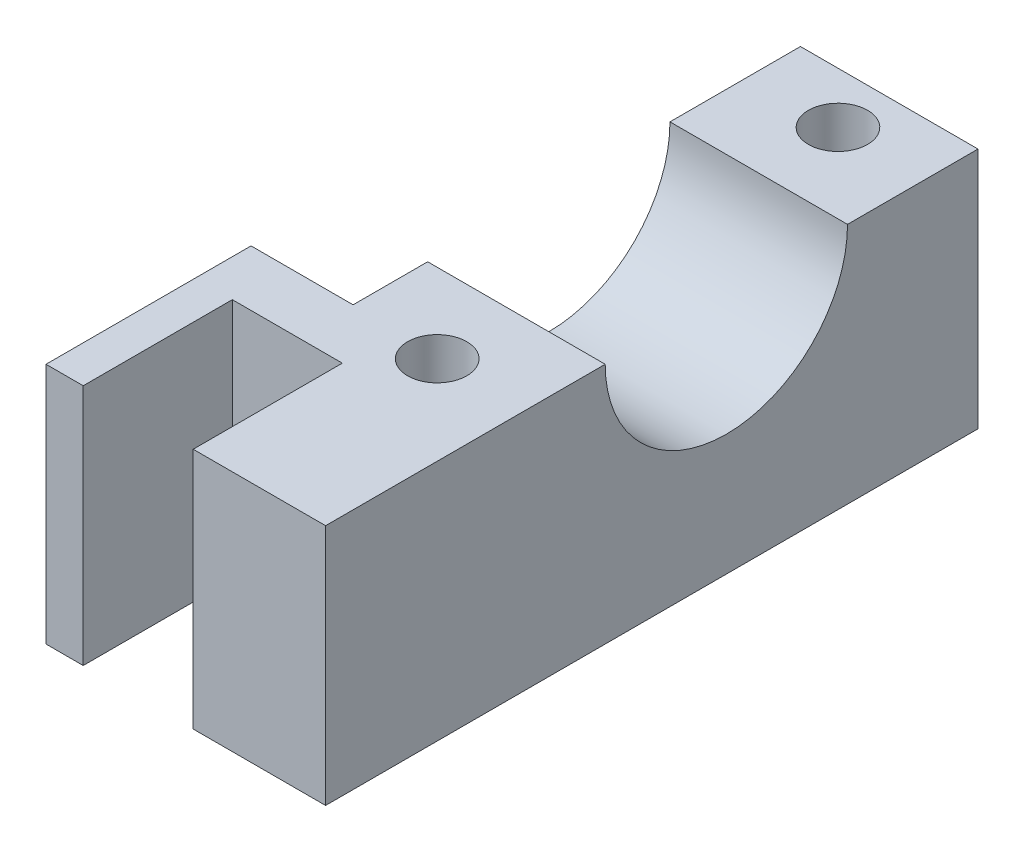
ISO-10303-21;
HEADER;
FILE_DESCRIPTION(('STEP AP214'),'2;1');
FILE_NAME('part.step','',(''),(''),'','','');
FILE_SCHEMA(('AUTOMOTIVE_DESIGN { 1 0 10303 214 1 1 1 1 }'));
ENDSEC;
DATA;
#1=APPLICATION_CONTEXT('core data for automotive mechanical design processes');
#2=APPLICATION_PROTOCOL_DEFINITION('international standard','automotive_design',2000,#1);
#3=PRODUCT_CONTEXT('',#1,'mechanical');
#4=PRODUCT('Part','Part','',(#3));
#5=PRODUCT_RELATED_PRODUCT_CATEGORY('part','',(#4));
#6=PRODUCT_DEFINITION_FORMATION('','',#4);
#7=PRODUCT_DEFINITION_CONTEXT('part definition',#1,'design');
#8=PRODUCT_DEFINITION('design','',#6,#7);
#9=PRODUCT_DEFINITION_SHAPE('','',#8);
#10=(LENGTH_UNIT() NAMED_UNIT(*) SI_UNIT(.MILLI.,.METRE.));
#11=(NAMED_UNIT(*) PLANE_ANGLE_UNIT() SI_UNIT($,.RADIAN.));
#12=(NAMED_UNIT(*) SI_UNIT($,.STERADIAN.) SOLID_ANGLE_UNIT());
#13=UNCERTAINTY_MEASURE_WITH_UNIT(LENGTH_MEASURE(1.E-05),#10,'distance_accuracy_value','');
#14=(GEOMETRIC_REPRESENTATION_CONTEXT(3) GLOBAL_UNCERTAINTY_ASSIGNED_CONTEXT((#13)) GLOBAL_UNIT_ASSIGNED_CONTEXT((#10,
#11,#12)) REPRESENTATION_CONTEXT('',''));
#15=CARTESIAN_POINT('',(0.,0.,0.));
#16=DIRECTION('',(0.,0.,1.));
#17=DIRECTION('',(1.,0.,0.));
#18=AXIS2_PLACEMENT_3D('',#15,#16,#17);
#19=CARTESIAN_POINT('',(15.,0.,13.5));
#20=DIRECTION('',(0.,0.,-1.));
#21=DIRECTION('',(0.,1.,0.));
#22=AXIS2_PLACEMENT_3D('',#19,#20,#21);
#23=PLANE('',#22);
#24=DIRECTION('',(0.,-1.,0.));
#25=VECTOR('',#24,1.);
#26=CARTESIAN_POINT('',(7.89684816109172,-13.,13.5));
#27=LINE('',#26,#25);
#28=CARTESIAN_POINT('',(7.89684816109172,0.,13.5));
#29=VERTEX_POINT('',#28);
#30=CARTESIAN_POINT('',(7.89684816109172,-13.,13.5));
#31=VERTEX_POINT('',#30);
#32=EDGE_CURVE('E151',#29,#31,#27,.T.);
#33=ORIENTED_EDGE('',*,*,#32,.F.);
#34=DIRECTION('',(-1.,0.,0.));
#35=VECTOR('',#34,1.);
#36=CARTESIAN_POINT('',(15.,0.,13.5));
#37=LINE('',#36,#35);
#38=CARTESIAN_POINT('',(1.99684816109172,0.,13.5));
#39=VERTEX_POINT('',#38);
#40=EDGE_CURVE('E209',#29,#39,#37,.T.);
#41=ORIENTED_EDGE('',*,*,#40,.T.);
#42=DIRECTION('',(0.,1.,0.));
#43=VECTOR('',#42,1.);
#44=CARTESIAN_POINT('',(1.99684816109172,-13.,13.5));
#45=LINE('',#44,#43);
#46=CARTESIAN_POINT('',(1.99684816109172,-13.,13.5));
#47=VERTEX_POINT('',#46);
#48=EDGE_CURVE('E167',#47,#39,#45,.T.);
#49=ORIENTED_EDGE('',*,*,#48,.F.);
#50=DIRECTION('',(-1.,0.,0.));
#51=VECTOR('',#50,1.);
#52=CARTESIAN_POINT('',(15.,-13.,13.5));
#53=LINE('',#52,#51);
#54=EDGE_CURVE('E11',#31,#47,#53,.T.);
#55=ORIENTED_EDGE('',*,*,#54,.F.);
#56=EDGE_LOOP('',(#33,#41,#49,#55));
#57=FACE_BOUND('',#56,.T.);
#58=ADVANCED_FACE('F33',(#57),#23,.F.);
#59=CARTESIAN_POINT('',(15.,-13.,13.5));
#60=DIRECTION('',(0.,1.,0.));
#61=DIRECTION('',(0.,0.,1.));
#62=AXIS2_PLACEMENT_3D('',#59,#60,#61);
#63=PLANE('',#62);
#64=CARTESIAN_POINT('',(10.2375,-13.,10.75));
#65=DIRECTION('',(0.,-1.,0.));
#66=DIRECTION('',(0.,0.,-1.));
#67=AXIS2_PLACEMENT_3D('',#64,#65,#66);
#68=CIRCLE('',#67,1.5875);
#69=CARTESIAN_POINT('',(10.2375,-13.,9.1625));
#70=VERTEX_POINT('',#69);
#71=EDGE_CURVE('E186',#70,#70,#68,.T.);
#72=ORIENTED_EDGE('',*,*,#71,.F.);
#73=EDGE_LOOP('',(#72));
#74=FACE_BOUND('',#73,.T.);
#75=CARTESIAN_POINT('',(10.2375,-13.,-10.75));
#76=DIRECTION('',(0.,-1.,0.));
#77=DIRECTION('',(0.,0.,-1.));
#78=AXIS2_PLACEMENT_3D('',#75,#76,#77);
#79=CIRCLE('',#78,1.5875);
#80=CARTESIAN_POINT('',(10.2375,-13.,-12.3375));
#81=VERTEX_POINT('',#80);
#82=EDGE_CURVE('E190',#81,#81,#79,.T.);
#83=ORIENTED_EDGE('',*,*,#82,.F.);
#84=EDGE_LOOP('',(#83));
#85=FACE_BOUND('',#84,.T.);
#86=DIRECTION('',(1.,0.,0.));
#87=VECTOR('',#86,1.);
#88=CARTESIAN_POINT('',(0.,-13.,10.5));
#89=LINE('',#88,#87);
#90=CARTESIAN_POINT('',(0.,-13.,10.5));
#91=VERTEX_POINT('',#90);
#92=CARTESIAN_POINT('',(5.475,-13.,10.5));
#93=VERTEX_POINT('',#92);
#94=EDGE_CURVE('E47',#91,#93,#89,.T.);
#95=ORIENTED_EDGE('',*,*,#94,.T.);
#96=DIRECTION('',(0.,0.,-1.));
#97=VECTOR('',#96,1.);
#98=CARTESIAN_POINT('',(5.475,-13.,-13.5));
#99=LINE('',#98,#97);
#100=CARTESIAN_POINT('',(5.475,-13.,-13.5));
#101=VERTEX_POINT('',#100);
#102=EDGE_CURVE('E130',#93,#101,#99,.T.);
#103=ORIENTED_EDGE('',*,*,#102,.T.);
#104=DIRECTION('',(-1.,0.,0.));
#105=VECTOR('',#104,1.);
#106=CARTESIAN_POINT('',(15.,-13.,-13.5));
#107=LINE('',#106,#105);
#108=CARTESIAN_POINT('',(15.,-13.,-13.5));
#109=VERTEX_POINT('',#108);
#110=EDGE_CURVE('E40',#109,#101,#107,.T.);
#111=ORIENTED_EDGE('',*,*,#110,.F.);
#112=DIRECTION('',(0.,0.,-1.));
#113=VECTOR('',#112,1.);
#114=CARTESIAN_POINT('',(15.,-13.,13.5));
#115=LINE('',#114,#113);
#116=CARTESIAN_POINT('',(15.,-13.,21.5));
#117=VERTEX_POINT('',#116);
#118=EDGE_CURVE('E198',#117,#109,#115,.T.);
#119=ORIENTED_EDGE('',*,*,#118,.F.);
#120=DIRECTION('',(1.,0.,0.));
#121=VECTOR('',#120,1.);
#122=CARTESIAN_POINT('',(7.89684816109172,-13.,21.5));
#123=LINE('',#122,#121);
#124=CARTESIAN_POINT('',(7.89684816109172,-13.,21.5));
#125=VERTEX_POINT('',#124);
#126=EDGE_CURVE('E152',#125,#117,#123,.T.);
#127=ORIENTED_EDGE('',*,*,#126,.F.);
#128=DIRECTION('',(0.,0.,-1.));
#129=VECTOR('',#128,1.);
#130=CARTESIAN_POINT('',(7.89684816109172,-13.,21.5));
#131=LINE('',#130,#129);
#132=EDGE_CURVE('E162',#125,#31,#131,.T.);
#133=ORIENTED_EDGE('',*,*,#132,.T.);
#134=ORIENTED_EDGE('',*,*,#54,.T.);
#135=DIRECTION('',(0.,0.,-1.));
#136=VECTOR('',#135,1.);
#137=CARTESIAN_POINT('',(1.99684816109172,-13.,21.5));
#138=LINE('',#137,#136);
#139=CARTESIAN_POINT('',(1.99684816109172,-13.,21.5));
#140=VERTEX_POINT('',#139);
#141=EDGE_CURVE('E183',#140,#47,#138,.T.);
#142=ORIENTED_EDGE('',*,*,#141,.F.);
#143=DIRECTION('',(1.,0.,0.));
#144=VECTOR('',#143,1.);
#145=CARTESIAN_POINT('',(0.,-13.,21.5));
#146=LINE('',#145,#144);
#147=CARTESIAN_POINT('',(0.,-13.,21.5));
#148=VERTEX_POINT('',#147);
#149=EDGE_CURVE('E171',#148,#140,#146,.T.);
#150=ORIENTED_EDGE('',*,*,#149,.F.);
#151=DIRECTION('',(0.,0.,-1.));
#152=VECTOR('',#151,1.);
#153=CARTESIAN_POINT('',(0.,-13.,13.5));
#154=LINE('',#153,#152);
#155=EDGE_CURVE('E139',#148,#91,#154,.T.);
#156=ORIENTED_EDGE('',*,*,#155,.T.);
#157=EDGE_LOOP('',(#95,#103,#111,#119,#127,#133,#134,#142,#150,#156));
#158=FACE_BOUND('',#157,.T.);
#159=ADVANCED_FACE('F137',(#74,#85,#158),#63,.F.);
#160=CARTESIAN_POINT('',(15.,0.,-13.5));
#161=DIRECTION('',(0.,0.,1.));
#162=DIRECTION('',(0.,-1.,0.));
#163=AXIS2_PLACEMENT_3D('',#160,#161,#162);
#164=PLANE('',#163);
#165=ORIENTED_EDGE('',*,*,#110,.T.);
#166=DIRECTION('',(0.,1.,0.));
#167=VECTOR('',#166,1.);
#168=CARTESIAN_POINT('',(5.475,-13.,-13.5));
#169=LINE('',#168,#167);
#170=CARTESIAN_POINT('',(5.475,0.,-13.5));
#171=VERTEX_POINT('',#170);
#172=EDGE_CURVE('E126',#101,#171,#169,.T.);
#173=ORIENTED_EDGE('',*,*,#172,.T.);
#174=DIRECTION('',(-1.,0.,0.));
#175=VECTOR('',#174,1.);
#176=CARTESIAN_POINT('',(15.,0.,-13.5));
#177=LINE('',#176,#175);
#178=CARTESIAN_POINT('',(15.,0.,-13.5));
#179=VERTEX_POINT('',#178);
#180=EDGE_CURVE('E219',#179,#171,#177,.T.);
#181=ORIENTED_EDGE('',*,*,#180,.F.);
#182=DIRECTION('',(0.,1.,0.));
#183=VECTOR('',#182,1.);
#184=CARTESIAN_POINT('',(15.,0.,-13.5));
#185=LINE('',#184,#183);
#186=EDGE_CURVE('E200',#109,#179,#185,.T.);
#187=ORIENTED_EDGE('',*,*,#186,.F.);
#188=EDGE_LOOP('',(#165,#173,#181,#187));
#189=FACE_BOUND('',#188,.T.);
#190=ADVANCED_FACE('F223',(#189),#164,.F.);
#191=CARTESIAN_POINT('',(15.,0.,-6.5));
#192=DIRECTION('',(0.,-1.,0.));
#193=DIRECTION('',(0.,0.,-1.));
#194=AXIS2_PLACEMENT_3D('',#191,#192,#193);
#195=PLANE('',#194);
#196=CARTESIAN_POINT('',(10.2375,0.,-10.75));
#197=DIRECTION('',(0.,-1.,0.));
#198=DIRECTION('',(0.,0.,-1.));
#199=AXIS2_PLACEMENT_3D('',#196,#197,#198);
#200=CIRCLE('',#199,1.5875);
#201=CARTESIAN_POINT('',(10.2375,0.,-12.3375));
#202=VERTEX_POINT('',#201);
#203=EDGE_CURVE('E193',#202,#202,#200,.T.);
#204=ORIENTED_EDGE('',*,*,#203,.T.);
#205=EDGE_LOOP('',(#204));
#206=FACE_BOUND('',#205,.T.);
#207=ORIENTED_EDGE('',*,*,#180,.T.);
#208=DIRECTION('',(0.,0.,-1.));
#209=VECTOR('',#208,1.);
#210=CARTESIAN_POINT('',(5.475,0.,-13.5));
#211=LINE('',#210,#209);
#212=CARTESIAN_POINT('',(5.475,0.,-6.5));
#213=VERTEX_POINT('',#212);
#214=EDGE_CURVE('E142',#213,#171,#211,.T.);
#215=ORIENTED_EDGE('',*,*,#214,.F.);
#216=DIRECTION('',(-1.,0.,0.));
#217=VECTOR('',#216,1.);
#218=CARTESIAN_POINT('',(15.,0.,-6.5));
#219=LINE('',#218,#217);
#220=CARTESIAN_POINT('',(15.,0.,-6.5));
#221=VERTEX_POINT('',#220);
#222=EDGE_CURVE('E216',#221,#213,#219,.T.);
#223=ORIENTED_EDGE('',*,*,#222,.F.);
#224=DIRECTION('',(0.,0.,1.));
#225=VECTOR('',#224,1.);
#226=CARTESIAN_POINT('',(15.,0.,-6.5));
#227=LINE('',#226,#225);
#228=EDGE_CURVE('E203',#179,#221,#227,.T.);
#229=ORIENTED_EDGE('',*,*,#228,.F.);
#230=EDGE_LOOP('',(#207,#215,#223,#229));
#231=FACE_BOUND('',#230,.T.);
#232=ADVANCED_FACE('F262',(#206,#231),#195,.F.);
#233=CARTESIAN_POINT('',(15.,0.,0.));
#234=DIRECTION('',(-1.,0.,0.));
#235=DIRECTION('',(0.,0.,1.));
#236=AXIS2_PLACEMENT_3D('',#233,#234,#235);
#237=CYLINDRICAL_SURFACE('',#236,6.5);
#238=ORIENTED_EDGE('',*,*,#222,.T.);
#239=CARTESIAN_POINT('',(5.475,0.,0.));
#240=DIRECTION('',(1.,0.,0.));
#241=DIRECTION('',(0.,0.,-1.));
#242=AXIS2_PLACEMENT_3D('',#239,#240,#241);
#243=CIRCLE('',#242,6.5);
#244=CARTESIAN_POINT('',(5.475,0.,6.5));
#245=VERTEX_POINT('',#244);
#246=EDGE_CURVE('E146',#213,#245,#243,.F.);
#247=ORIENTED_EDGE('',*,*,#246,.T.);
#248=DIRECTION('',(-1.,0.,0.));
#249=VECTOR('',#248,1.);
#250=CARTESIAN_POINT('',(15.,0.,6.5));
#251=LINE('',#250,#249);
#252=CARTESIAN_POINT('',(15.,0.,6.5));
#253=VERTEX_POINT('',#252);
#254=EDGE_CURVE('E213',#253,#245,#251,.T.);
#255=ORIENTED_EDGE('',*,*,#254,.F.);
#256=CARTESIAN_POINT('',(15.,0.,0.));
#257=DIRECTION('',(-1.,0.,0.));
#258=DIRECTION('',(0.,0.,-1.));
#259=AXIS2_PLACEMENT_3D('',#256,#257,#258);
#260=CIRCLE('',#259,6.5);
#261=EDGE_CURVE('E205',#221,#253,#260,.T.);
#262=ORIENTED_EDGE('',*,*,#261,.F.);
#263=EDGE_LOOP('',(#238,#247,#255,#262));
#264=FACE_BOUND('',#263,.T.);
#265=ADVANCED_FACE('F257',(#264),#237,.F.);
#266=CARTESIAN_POINT('',(15.,0.,13.5));
#267=DIRECTION('',(0.,-1.,0.));
#268=DIRECTION('',(0.,0.,-1.));
#269=AXIS2_PLACEMENT_3D('',#266,#267,#268);
#270=PLANE('',#269);
#271=CARTESIAN_POINT('',(10.2375,0.,10.75));
#272=DIRECTION('',(0.,-1.,0.));
#273=DIRECTION('',(0.,0.,-1.));
#274=AXIS2_PLACEMENT_3D('',#271,#272,#273);
#275=CIRCLE('',#274,1.5875);
#276=CARTESIAN_POINT('',(10.2375,0.,9.1625));
#277=VERTEX_POINT('',#276);
#278=EDGE_CURVE('E187',#277,#277,#275,.T.);
#279=ORIENTED_EDGE('',*,*,#278,.T.);
#280=EDGE_LOOP('',(#279));
#281=FACE_BOUND('',#280,.T.);
#282=ORIENTED_EDGE('',*,*,#254,.T.);
#283=CARTESIAN_POINT('',(5.475,0.,10.5));
#284=VERTEX_POINT('',#283);
#285=EDGE_CURVE('E140',#284,#245,#211,.T.);
#286=ORIENTED_EDGE('',*,*,#285,.F.);
#287=DIRECTION('',(1.,0.,0.));
#288=VECTOR('',#287,1.);
#289=CARTESIAN_POINT('',(0.,0.,10.5));
#290=LINE('',#289,#288);
#291=CARTESIAN_POINT('',(0.,0.,10.5));
#292=VERTEX_POINT('',#291);
#293=EDGE_CURVE('E123',#292,#284,#290,.T.);
#294=ORIENTED_EDGE('',*,*,#293,.F.);
#295=DIRECTION('',(0.,0.,1.));
#296=VECTOR('',#295,1.);
#297=CARTESIAN_POINT('',(0.,0.,13.5));
#298=LINE('',#297,#296);
#299=CARTESIAN_POINT('',(0.,0.,21.5));
#300=VERTEX_POINT('',#299);
#301=EDGE_CURVE('E201',#292,#300,#298,.T.);
#302=ORIENTED_EDGE('',*,*,#301,.T.);
#303=DIRECTION('',(-1.,0.,0.));
#304=VECTOR('',#303,1.);
#305=CARTESIAN_POINT('',(0.,0.,21.5));
#306=LINE('',#305,#304);
#307=CARTESIAN_POINT('',(1.99684816109172,0.,21.5));
#308=VERTEX_POINT('',#307);
#309=EDGE_CURVE('E175',#308,#300,#306,.T.);
#310=ORIENTED_EDGE('',*,*,#309,.F.);
#311=DIRECTION('',(0.,0.,-1.));
#312=VECTOR('',#311,1.);
#313=CARTESIAN_POINT('',(1.99684816109172,0.,21.5));
#314=LINE('',#313,#312);
#315=EDGE_CURVE('E178',#308,#39,#314,.T.);
#316=ORIENTED_EDGE('',*,*,#315,.T.);
#317=ORIENTED_EDGE('',*,*,#40,.F.);
#318=DIRECTION('',(0.,0.,-1.));
#319=VECTOR('',#318,1.);
#320=CARTESIAN_POINT('',(7.89684816109172,0.,21.5));
#321=LINE('',#320,#319);
#322=CARTESIAN_POINT('',(7.89684816109172,0.,21.5));
#323=VERTEX_POINT('',#322);
#324=EDGE_CURVE('E165',#323,#29,#321,.T.);
#325=ORIENTED_EDGE('',*,*,#324,.F.);
#326=DIRECTION('',(-1.,0.,0.));
#327=VECTOR('',#326,1.);
#328=CARTESIAN_POINT('',(7.89684816109172,0.,21.5));
#329=LINE('',#328,#327);
#330=CARTESIAN_POINT('',(15.,0.,21.5));
#331=VERTEX_POINT('',#330);
#332=EDGE_CURVE('E158',#331,#323,#329,.T.);
#333=ORIENTED_EDGE('',*,*,#332,.F.);
#334=DIRECTION('',(0.,0.,1.));
#335=VECTOR('',#334,1.);
#336=CARTESIAN_POINT('',(15.,0.,13.5));
#337=LINE('',#336,#335);
#338=EDGE_CURVE('E207',#253,#331,#337,.T.);
#339=ORIENTED_EDGE('',*,*,#338,.F.);
#340=EDGE_LOOP('',(#282,#286,#294,#302,#310,#316,#317,#325,#333,#339));
#341=FACE_BOUND('',#340,.T.);
#342=ADVANCED_FACE('F253',(#281,#341),#270,.F.);
#343=CARTESIAN_POINT('',(15.,0.,0.));
#344=DIRECTION('',(1.,0.,0.));
#345=DIRECTION('',(0.,0.,-1.));
#346=AXIS2_PLACEMENT_3D('',#343,#344,#345);
#347=PLANE('',#346);
#348=ORIENTED_EDGE('',*,*,#338,.T.);
#349=DIRECTION('',(0.,1.,0.));
#350=VECTOR('',#349,1.);
#351=CARTESIAN_POINT('',(15.,0.,21.5));
#352=LINE('',#351,#350);
#353=EDGE_CURVE('E155',#117,#331,#352,.T.);
#354=ORIENTED_EDGE('',*,*,#353,.F.);
#355=ORIENTED_EDGE('',*,*,#118,.T.);
#356=ORIENTED_EDGE('',*,*,#186,.T.);
#357=ORIENTED_EDGE('',*,*,#228,.T.);
#358=ORIENTED_EDGE('',*,*,#261,.T.);
#359=EDGE_LOOP('',(#348,#354,#355,#356,#357,#358));
#360=FACE_BOUND('',#359,.T.);
#361=ADVANCED_FACE('F228',(#360),#347,.T.);
#362=CARTESIAN_POINT('',(0.,0.,0.));
#363=DIRECTION('',(1.,0.,0.));
#364=DIRECTION('',(0.,0.,-1.));
#365=AXIS2_PLACEMENT_3D('',#362,#363,#364);
#366=PLANE('',#365);
#367=ORIENTED_EDGE('',*,*,#301,.F.);
#368=DIRECTION('',(0.,1.,0.));
#369=VECTOR('',#368,1.);
#370=CARTESIAN_POINT('',(0.,-13.,10.5));
#371=LINE('',#370,#369);
#372=EDGE_CURVE('E127',#91,#292,#371,.T.);
#373=ORIENTED_EDGE('',*,*,#372,.F.);
#374=ORIENTED_EDGE('',*,*,#155,.F.);
#375=DIRECTION('',(0.,-1.,0.));
#376=VECTOR('',#375,1.);
#377=CARTESIAN_POINT('',(0.,0.,21.5));
#378=LINE('',#377,#376);
#379=EDGE_CURVE('E168',#300,#148,#378,.T.);
#380=ORIENTED_EDGE('',*,*,#379,.F.);
#381=EDGE_LOOP('',(#367,#373,#374,#380));
#382=FACE_BOUND('',#381,.T.);
#383=ADVANCED_FACE('F251',(#382),#366,.F.);
#384=CARTESIAN_POINT('',(10.2375,0.,-10.75));
#385=DIRECTION('',(0.,-1.,0.));
#386=DIRECTION('',(0.,0.,-1.));
#387=AXIS2_PLACEMENT_3D('',#384,#385,#386);
#388=CYLINDRICAL_SURFACE('',#387,1.5875);
#389=CARTESIAN_POINT('',(10.2375,0.,-12.3375));
#390=CARTESIAN_POINT('',(10.2375,-0.135416666666667,-12.3375));
#391=CARTESIAN_POINT('',(10.2375,-0.270833333333333,-12.3375));
#392=CARTESIAN_POINT('',(10.2375,-0.541666666666667,-12.3375));
#393=CARTESIAN_POINT('',(10.2375,-0.677083333333333,-12.3375));
#394=CARTESIAN_POINT('',(10.2375,-0.947916666666667,-12.3375));
#395=CARTESIAN_POINT('',(10.2375,-1.08333333333333,-12.3375));
#396=CARTESIAN_POINT('',(10.2375,-1.35416666666667,-12.3375));
#397=CARTESIAN_POINT('',(10.2375,-1.48958333333333,-12.3375));
#398=CARTESIAN_POINT('',(10.2375,-1.76041666666667,-12.3375));
#399=CARTESIAN_POINT('',(10.2375,-1.89583333333333,-12.3375));
#400=CARTESIAN_POINT('',(10.2375,-2.16666666666667,-12.3375));
#401=CARTESIAN_POINT('',(10.2375,-2.30208333333333,-12.3375));
#402=CARTESIAN_POINT('',(10.2375,-2.57291666666667,-12.3375));
#403=CARTESIAN_POINT('',(10.2375,-2.70833333333333,-12.3375));
#404=CARTESIAN_POINT('',(10.2375,-2.97916666666667,-12.3375));
#405=CARTESIAN_POINT('',(10.2375,-3.11458333333333,-12.3375));
#406=CARTESIAN_POINT('',(10.2375,-3.38541666666667,-12.3375));
#407=CARTESIAN_POINT('',(10.2375,-3.52083333333333,-12.3375));
#408=CARTESIAN_POINT('',(10.2375,-3.79166666666667,-12.3375));
#409=CARTESIAN_POINT('',(10.2375,-3.92708333333333,-12.3375));
#410=CARTESIAN_POINT('',(10.2375,-4.19791666666667,-12.3375));
#411=CARTESIAN_POINT('',(10.2375,-4.33333333333333,-12.3375));
#412=CARTESIAN_POINT('',(10.2375,-4.60416666666667,-12.3375));
#413=CARTESIAN_POINT('',(10.2375,-4.73958333333333,-12.3375));
#414=CARTESIAN_POINT('',(10.2375,-5.01041666666667,-12.3375));
#415=CARTESIAN_POINT('',(10.2375,-5.14583333333333,-12.3375));
#416=CARTESIAN_POINT('',(10.2375,-5.41666666666667,-12.3375));
#417=CARTESIAN_POINT('',(10.2375,-5.55208333333333,-12.3375));
#418=CARTESIAN_POINT('',(10.2375,-5.82291666666667,-12.3375));
#419=CARTESIAN_POINT('',(10.2375,-5.95833333333333,-12.3375));
#420=CARTESIAN_POINT('',(10.2375,-6.22916666666667,-12.3375));
#421=CARTESIAN_POINT('',(10.2375,-6.36458333333333,-12.3375));
#422=CARTESIAN_POINT('',(10.2375,-6.63541666666667,-12.3375));
#423=CARTESIAN_POINT('',(10.2375,-6.77083333333333,-12.3375));
#424=CARTESIAN_POINT('',(10.2375,-7.04166666666667,-12.3375));
#425=CARTESIAN_POINT('',(10.2375,-7.17708333333333,-12.3375));
#426=CARTESIAN_POINT('',(10.2375,-7.44791666666667,-12.3375));
#427=CARTESIAN_POINT('',(10.2375,-7.58333333333333,-12.3375));
#428=CARTESIAN_POINT('',(10.2375,-7.85416666666667,-12.3375));
#429=CARTESIAN_POINT('',(10.2375,-7.98958333333333,-12.3375));
#430=CARTESIAN_POINT('',(10.2375,-8.26041666666667,-12.3375));
#431=CARTESIAN_POINT('',(10.2375,-8.39583333333333,-12.3375));
#432=CARTESIAN_POINT('',(10.2375,-8.66666666666667,-12.3375));
#433=CARTESIAN_POINT('',(10.2375,-8.80208333333333,-12.3375));
#434=CARTESIAN_POINT('',(10.2375,-9.07291666666667,-12.3375));
#435=CARTESIAN_POINT('',(10.2375,-9.20833333333333,-12.3375));
#436=CARTESIAN_POINT('',(10.2375,-9.47916666666667,-12.3375));
#437=CARTESIAN_POINT('',(10.2375,-9.61458333333333,-12.3375));
#438=CARTESIAN_POINT('',(10.2375,-9.88541666666667,-12.3375));
#439=CARTESIAN_POINT('',(10.2375,-10.0208333333333,-12.3375));
#440=CARTESIAN_POINT('',(10.2375,-10.2916666666667,-12.3375));
#441=CARTESIAN_POINT('',(10.2375,-10.4270833333333,-12.3375));
#442=CARTESIAN_POINT('',(10.2375,-10.6979166666667,-12.3375));
#443=CARTESIAN_POINT('',(10.2375,-10.8333333333333,-12.3375));
#444=CARTESIAN_POINT('',(10.2375,-11.1041666666667,-12.3375));
#445=CARTESIAN_POINT('',(10.2375,-11.2395833333333,-12.3375));
#446=CARTESIAN_POINT('',(10.2375,-11.5104166666667,-12.3375));
#447=CARTESIAN_POINT('',(10.2375,-11.6458333333333,-12.3375));
#448=CARTESIAN_POINT('',(10.2375,-11.9166666666667,-12.3375));
#449=CARTESIAN_POINT('',(10.2375,-12.0520833333333,-12.3375));
#450=CARTESIAN_POINT('',(10.2375,-12.3229166666667,-12.3375));
#451=CARTESIAN_POINT('',(10.2375,-12.4583333333333,-12.3375));
#452=CARTESIAN_POINT('',(10.2375,-12.7291666666667,-12.3375));
#453=CARTESIAN_POINT('',(10.2375,-12.8645833333333,-12.3375));
#454=CARTESIAN_POINT('',(10.2375,-13.,-12.3375));
#455=B_SPLINE_CURVE_WITH_KNOTS('',3,(#389,#390,#391,#392,#393,#394,#395,#396,#397,#398,#399,
#400,#401,#402,#403,#404,#405,#406,#407,#408,#409,#410,#411,#412,#413,#414,#415,#416,#417,#418,
#419,#420,#421,#422,#423,#424,#425,#426,#427,#428,#429,#430,#431,#432,#433,#434,#435,#436,#437,
#438,#439,#440,#441,#442,#443,#444,#445,#446,#447,#448,#449,#450,#451,#452,#453,#454),
.UNSPECIFIED.,.F.,.F.,(4,2,2,2,2,2,2,2,2,2,2,2,2,2,2,2,2,2,2,2,2,2,2,2,2,2,2,2,2,2,2,2,4),(0.,
0.40625,0.8125,1.21875,1.625,2.03125,2.4375,2.84375,3.25,3.65625,4.0625,4.46875,4.875,5.28125,
5.6875,6.09375,6.5,6.90625,7.3125,7.71875,8.125,8.53125,8.9375,9.34375,9.75,10.15625,10.5625,
10.96875,11.375,11.78125,12.1875,12.59375,13.),.UNSPECIFIED.);
#456=EDGE_CURVE('BSEAM284',#202,#81,#455,.T.);
#457=ORIENTED_EDGE('',*,*,#203,.F.);
#458=ORIENTED_EDGE('',*,*,#82,.T.);
#459=ORIENTED_EDGE('',*,*,#456,.T.);
#460=ORIENTED_EDGE('',*,*,#456,.F.);
#461=EDGE_LOOP('',(#457,#459,#458,#460));
#462=FACE_BOUND('',#461,.T.);
#463=ADVANCED_FACE('F284',(#462),#388,.F.);
#464=CARTESIAN_POINT('',(10.2375,0.,10.75));
#465=DIRECTION('',(0.,-1.,0.));
#466=DIRECTION('',(0.,0.,-1.));
#467=AXIS2_PLACEMENT_3D('',#464,#465,#466);
#468=CYLINDRICAL_SURFACE('',#467,1.5875);
#469=CARTESIAN_POINT('',(10.2375,0.,9.1625));
#470=CARTESIAN_POINT('',(10.2375,-0.135416666666667,9.1625));
#471=CARTESIAN_POINT('',(10.2375,-0.270833333333333,9.1625));
#472=CARTESIAN_POINT('',(10.2375,-0.541666666666667,9.1625));
#473=CARTESIAN_POINT('',(10.2375,-0.677083333333333,9.1625));
#474=CARTESIAN_POINT('',(10.2375,-0.947916666666667,9.1625));
#475=CARTESIAN_POINT('',(10.2375,-1.08333333333333,9.1625));
#476=CARTESIAN_POINT('',(10.2375,-1.35416666666667,9.1625));
#477=CARTESIAN_POINT('',(10.2375,-1.48958333333333,9.1625));
#478=CARTESIAN_POINT('',(10.2375,-1.76041666666667,9.1625));
#479=CARTESIAN_POINT('',(10.2375,-1.89583333333333,9.1625));
#480=CARTESIAN_POINT('',(10.2375,-2.16666666666667,9.1625));
#481=CARTESIAN_POINT('',(10.2375,-2.30208333333333,9.1625));
#482=CARTESIAN_POINT('',(10.2375,-2.57291666666667,9.1625));
#483=CARTESIAN_POINT('',(10.2375,-2.70833333333333,9.1625));
#484=CARTESIAN_POINT('',(10.2375,-2.97916666666667,9.1625));
#485=CARTESIAN_POINT('',(10.2375,-3.11458333333333,9.1625));
#486=CARTESIAN_POINT('',(10.2375,-3.38541666666667,9.1625));
#487=CARTESIAN_POINT('',(10.2375,-3.52083333333333,9.1625));
#488=CARTESIAN_POINT('',(10.2375,-3.79166666666667,9.1625));
#489=CARTESIAN_POINT('',(10.2375,-3.92708333333333,9.1625));
#490=CARTESIAN_POINT('',(10.2375,-4.19791666666667,9.1625));
#491=CARTESIAN_POINT('',(10.2375,-4.33333333333333,9.1625));
#492=CARTESIAN_POINT('',(10.2375,-4.60416666666667,9.1625));
#493=CARTESIAN_POINT('',(10.2375,-4.73958333333333,9.1625));
#494=CARTESIAN_POINT('',(10.2375,-5.01041666666667,9.1625));
#495=CARTESIAN_POINT('',(10.2375,-5.14583333333333,9.1625));
#496=CARTESIAN_POINT('',(10.2375,-5.41666666666667,9.1625));
#497=CARTESIAN_POINT('',(10.2375,-5.55208333333333,9.1625));
#498=CARTESIAN_POINT('',(10.2375,-5.82291666666667,9.1625));
#499=CARTESIAN_POINT('',(10.2375,-5.95833333333333,9.1625));
#500=CARTESIAN_POINT('',(10.2375,-6.22916666666667,9.1625));
#501=CARTESIAN_POINT('',(10.2375,-6.36458333333333,9.1625));
#502=CARTESIAN_POINT('',(10.2375,-6.63541666666667,9.1625));
#503=CARTESIAN_POINT('',(10.2375,-6.77083333333333,9.1625));
#504=CARTESIAN_POINT('',(10.2375,-7.04166666666667,9.1625));
#505=CARTESIAN_POINT('',(10.2375,-7.17708333333333,9.1625));
#506=CARTESIAN_POINT('',(10.2375,-7.44791666666667,9.1625));
#507=CARTESIAN_POINT('',(10.2375,-7.58333333333333,9.1625));
#508=CARTESIAN_POINT('',(10.2375,-7.85416666666667,9.1625));
#509=CARTESIAN_POINT('',(10.2375,-7.98958333333333,9.1625));
#510=CARTESIAN_POINT('',(10.2375,-8.26041666666667,9.1625));
#511=CARTESIAN_POINT('',(10.2375,-8.39583333333333,9.1625));
#512=CARTESIAN_POINT('',(10.2375,-8.66666666666667,9.1625));
#513=CARTESIAN_POINT('',(10.2375,-8.80208333333333,9.1625));
#514=CARTESIAN_POINT('',(10.2375,-9.07291666666667,9.1625));
#515=CARTESIAN_POINT('',(10.2375,-9.20833333333333,9.1625));
#516=CARTESIAN_POINT('',(10.2375,-9.47916666666667,9.1625));
#517=CARTESIAN_POINT('',(10.2375,-9.61458333333333,9.1625));
#518=CARTESIAN_POINT('',(10.2375,-9.88541666666667,9.1625));
#519=CARTESIAN_POINT('',(10.2375,-10.0208333333333,9.1625));
#520=CARTESIAN_POINT('',(10.2375,-10.2916666666667,9.1625));
#521=CARTESIAN_POINT('',(10.2375,-10.4270833333333,9.1625));
#522=CARTESIAN_POINT('',(10.2375,-10.6979166666667,9.1625));
#523=CARTESIAN_POINT('',(10.2375,-10.8333333333333,9.1625));
#524=CARTESIAN_POINT('',(10.2375,-11.1041666666667,9.1625));
#525=CARTESIAN_POINT('',(10.2375,-11.2395833333333,9.1625));
#526=CARTESIAN_POINT('',(10.2375,-11.5104166666667,9.1625));
#527=CARTESIAN_POINT('',(10.2375,-11.6458333333333,9.1625));
#528=CARTESIAN_POINT('',(10.2375,-11.9166666666667,9.1625));
#529=CARTESIAN_POINT('',(10.2375,-12.0520833333333,9.1625));
#530=CARTESIAN_POINT('',(10.2375,-12.3229166666667,9.1625));
#531=CARTESIAN_POINT('',(10.2375,-12.4583333333333,9.1625));
#532=CARTESIAN_POINT('',(10.2375,-12.7291666666667,9.1625));
#533=CARTESIAN_POINT('',(10.2375,-12.8645833333333,9.1625));
#534=CARTESIAN_POINT('',(10.2375,-13.,9.1625));
#535=B_SPLINE_CURVE_WITH_KNOTS('',3,(#469,#470,#471,#472,#473,#474,#475,#476,#477,#478,#479,
#480,#481,#482,#483,#484,#485,#486,#487,#488,#489,#490,#491,#492,#493,#494,#495,#496,#497,#498,
#499,#500,#501,#502,#503,#504,#505,#506,#507,#508,#509,#510,#511,#512,#513,#514,#515,#516,#517,
#518,#519,#520,#521,#522,#523,#524,#525,#526,#527,#528,#529,#530,#531,#532,#533,#534),
.UNSPECIFIED.,.F.,.F.,(4,2,2,2,2,2,2,2,2,2,2,2,2,2,2,2,2,2,2,2,2,2,2,2,2,2,2,2,2,2,2,2,4),(0.,
0.40625,0.8125,1.21875,1.625,2.03125,2.4375,2.84375,3.25,3.65625,4.0625,4.46875,4.875,5.28125,
5.6875,6.09375,6.5,6.90625,7.3125,7.71875,8.125,8.53125,8.9375,9.34375,9.75,10.15625,10.5625,
10.96875,11.375,11.78125,12.1875,12.59375,13.),.UNSPECIFIED.);
#536=EDGE_CURVE('BSEAM286',#277,#70,#535,.T.);
#537=ORIENTED_EDGE('',*,*,#278,.F.);
#538=ORIENTED_EDGE('',*,*,#71,.T.);
#539=ORIENTED_EDGE('',*,*,#536,.T.);
#540=ORIENTED_EDGE('',*,*,#536,.F.);
#541=EDGE_LOOP('',(#537,#539,#538,#540));
#542=FACE_BOUND('',#541,.T.);
#543=ADVANCED_FACE('F286',(#542),#468,.F.);
#544=CARTESIAN_POINT('',(1.99684816109172,-13.,21.5));
#545=DIRECTION('',(-1.,0.,0.));
#546=DIRECTION('',(0.,0.,1.));
#547=AXIS2_PLACEMENT_3D('',#544,#545,#546);
#548=PLANE('',#547);
#549=ORIENTED_EDGE('',*,*,#48,.T.);
#550=ORIENTED_EDGE('',*,*,#315,.F.);
#551=DIRECTION('',(0.,1.,0.));
#552=VECTOR('',#551,1.);
#553=CARTESIAN_POINT('',(1.99684816109172,-13.,21.5));
#554=LINE('',#553,#552);
#555=EDGE_CURVE('E173',#140,#308,#554,.T.);
#556=ORIENTED_EDGE('',*,*,#555,.F.);
#557=ORIENTED_EDGE('',*,*,#141,.T.);
#558=EDGE_LOOP('',(#549,#550,#556,#557));
#559=FACE_BOUND('',#558,.T.);
#560=ADVANCED_FACE('F244',(#559),#548,.F.);
#561=CARTESIAN_POINT('',(0.,0.,21.5));
#562=DIRECTION('',(0.,0.,1.));
#563=DIRECTION('',(1.,0.,0.));
#564=AXIS2_PLACEMENT_3D('',#561,#562,#563);
#565=PLANE('',#564);
#566=ORIENTED_EDGE('',*,*,#379,.T.);
#567=ORIENTED_EDGE('',*,*,#149,.T.);
#568=ORIENTED_EDGE('',*,*,#555,.T.);
#569=ORIENTED_EDGE('',*,*,#309,.T.);
#570=EDGE_LOOP('',(#566,#567,#568,#569));
#571=FACE_BOUND('',#570,.T.);
#572=ADVANCED_FACE('F247',(#571),#565,.T.);
#573=CARTESIAN_POINT('',(7.89684816109172,-13.,21.5));
#574=DIRECTION('',(1.,0.,0.));
#575=DIRECTION('',(0.,0.,-1.));
#576=AXIS2_PLACEMENT_3D('',#573,#574,#575);
#577=PLANE('',#576);
#578=ORIENTED_EDGE('',*,*,#32,.T.);
#579=ORIENTED_EDGE('',*,*,#132,.F.);
#580=DIRECTION('',(0.,-1.,0.));
#581=VECTOR('',#580,1.);
#582=CARTESIAN_POINT('',(7.89684816109172,-13.,21.5));
#583=LINE('',#582,#581);
#584=EDGE_CURVE('E160',#323,#125,#583,.T.);
#585=ORIENTED_EDGE('',*,*,#584,.F.);
#586=ORIENTED_EDGE('',*,*,#324,.T.);
#587=EDGE_LOOP('',(#578,#579,#585,#586));
#588=FACE_BOUND('',#587,.T.);
#589=ADVANCED_FACE('F237',(#588),#577,.F.);
#590=CARTESIAN_POINT('',(0.,0.,21.5));
#591=DIRECTION('',(0.,0.,-1.));
#592=DIRECTION('',(-1.,0.,0.));
#593=AXIS2_PLACEMENT_3D('',#590,#591,#592);
#594=PLANE('',#593);
#595=ORIENTED_EDGE('',*,*,#126,.T.);
#596=ORIENTED_EDGE('',*,*,#353,.T.);
#597=ORIENTED_EDGE('',*,*,#332,.T.);
#598=ORIENTED_EDGE('',*,*,#584,.T.);
#599=EDGE_LOOP('',(#595,#596,#597,#598));
#600=FACE_BOUND('',#599,.T.);
#601=ADVANCED_FACE('F232',(#600),#594,.F.);
#602=CARTESIAN_POINT('',(5.475,-13.,-13.5));
#603=DIRECTION('',(1.,0.,0.));
#604=DIRECTION('',(0.,0.,-1.));
#605=AXIS2_PLACEMENT_3D('',#602,#603,#604);
#606=PLANE('',#605);
#607=ORIENTED_EDGE('',*,*,#214,.T.);
#608=ORIENTED_EDGE('',*,*,#172,.F.);
#609=ORIENTED_EDGE('',*,*,#102,.F.);
#610=DIRECTION('',(0.,1.,0.));
#611=VECTOR('',#610,1.);
#612=CARTESIAN_POINT('',(5.475,-13.,10.5));
#613=LINE('',#612,#611);
#614=EDGE_CURVE('E119',#93,#284,#613,.T.);
#615=ORIENTED_EDGE('',*,*,#614,.T.);
#616=ORIENTED_EDGE('',*,*,#285,.T.);
#617=ORIENTED_EDGE('',*,*,#246,.F.);
#618=EDGE_LOOP('',(#607,#608,#609,#615,#616,#617));
#619=FACE_BOUND('',#618,.T.);
#620=ADVANCED_FACE('F131',(#619),#606,.F.);
#621=CARTESIAN_POINT('',(0.,-13.,10.5));
#622=DIRECTION('',(0.,0.,1.));
#623=DIRECTION('',(1.,0.,0.));
#624=AXIS2_PLACEMENT_3D('',#621,#622,#623);
#625=PLANE('',#624);
#626=ORIENTED_EDGE('',*,*,#293,.T.);
#627=ORIENTED_EDGE('',*,*,#614,.F.);
#628=ORIENTED_EDGE('',*,*,#94,.F.);
#629=ORIENTED_EDGE('',*,*,#372,.T.);
#630=EDGE_LOOP('',(#626,#627,#628,#629));
#631=FACE_BOUND('',#630,.T.);
#632=ADVANCED_FACE('F121',(#631),#625,.F.);
#633=CLOSED_SHELL('',(#58,#159,#190,#232,#265,#342,#361,#383,#463,#543,#560,#572,#589,#601,#620,#632));
#634=MANIFOLD_SOLID_BREP('B2',#633);
#635=ADVANCED_BREP_SHAPE_REPRESENTATION('',(#18,#634),#14);
#636=SHAPE_DEFINITION_REPRESENTATION(#9,#635);
ENDSEC;
END-ISO-10303-21;
